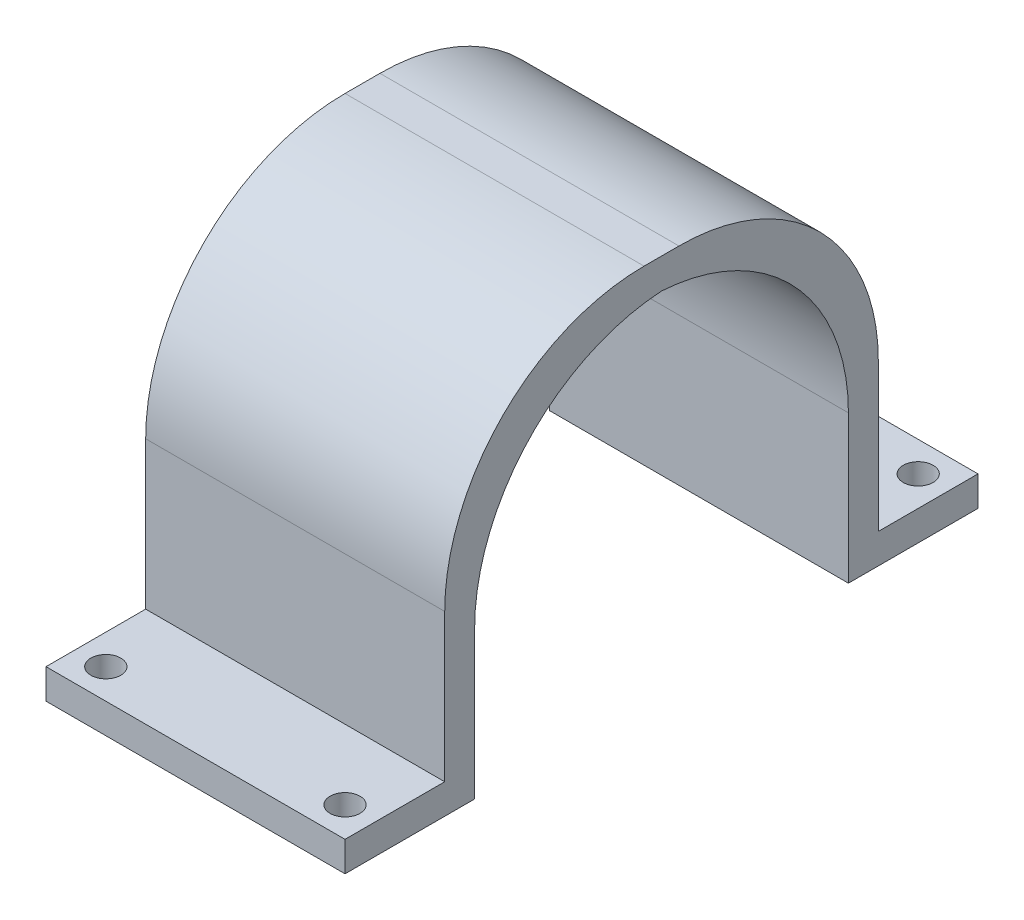
ISO-10303-21;
HEADER;
FILE_DESCRIPTION(('STEP AP214'),'2;1');
FILE_NAME('part.step','',(''),(''),'','','');
FILE_SCHEMA(('AUTOMOTIVE_DESIGN { 1 0 10303 214 1 1 1 1 }'));
ENDSEC;
DATA;
#1=APPLICATION_CONTEXT('core data for automotive mechanical design processes');
#2=APPLICATION_PROTOCOL_DEFINITION('international standard','automotive_design',2000,#1);
#3=PRODUCT_CONTEXT('',#1,'mechanical');
#4=PRODUCT('Part','Part','',(#3));
#5=PRODUCT_RELATED_PRODUCT_CATEGORY('part','',(#4));
#6=PRODUCT_DEFINITION_FORMATION('','',#4);
#7=PRODUCT_DEFINITION_CONTEXT('part definition',#1,'design');
#8=PRODUCT_DEFINITION('design','',#6,#7);
#9=PRODUCT_DEFINITION_SHAPE('','',#8);
#10=(LENGTH_UNIT() NAMED_UNIT(*) SI_UNIT(.MILLI.,.METRE.));
#11=(NAMED_UNIT(*) PLANE_ANGLE_UNIT() SI_UNIT($,.RADIAN.));
#12=(NAMED_UNIT(*) SI_UNIT($,.STERADIAN.) SOLID_ANGLE_UNIT());
#13=UNCERTAINTY_MEASURE_WITH_UNIT(LENGTH_MEASURE(1.E-05),#10,'distance_accuracy_value','');
#14=(GEOMETRIC_REPRESENTATION_CONTEXT(3) GLOBAL_UNCERTAINTY_ASSIGNED_CONTEXT((#13)) GLOBAL_UNIT_ASSIGNED_CONTEXT((#10,
#11,#12)) REPRESENTATION_CONTEXT('',''));
#15=CARTESIAN_POINT('',(0.,0.,0.));
#16=DIRECTION('',(0.,0.,1.));
#17=DIRECTION('',(1.,0.,0.));
#18=AXIS2_PLACEMENT_3D('',#15,#16,#17);
#19=CARTESIAN_POINT('',(30.,-3.,0.));
#20=DIRECTION('',(0.,0.,-1.));
#21=DIRECTION('',(-1.,0.,0.));
#22=AXIS2_PLACEMENT_3D('',#19,#20,#21);
#23=PLANE('',#22);
#24=DIRECTION('',(0.,-1.,0.));
#25=VECTOR('',#24,1.);
#26=CARTESIAN_POINT('',(0.,-3.,0.));
#27=LINE('',#26,#25);
#28=CARTESIAN_POINT('',(0.,0.,0.));
#29=VERTEX_POINT('',#28);
#30=CARTESIAN_POINT('',(0.,-3.,0.));
#31=VERTEX_POINT('',#30);
#32=EDGE_CURVE('E177',#29,#31,#27,.T.);
#33=ORIENTED_EDGE('',*,*,#32,.T.);
#34=DIRECTION('',(-1.,0.,0.));
#35=VECTOR('',#34,1.);
#36=CARTESIAN_POINT('',(30.,-3.,0.));
#37=LINE('',#36,#35);
#38=CARTESIAN_POINT('',(30.,-3.,0.));
#39=VERTEX_POINT('',#38);
#40=EDGE_CURVE('E156',#39,#31,#37,.T.);
#41=ORIENTED_EDGE('',*,*,#40,.F.);
#42=DIRECTION('',(0.,-1.,0.));
#43=VECTOR('',#42,1.);
#44=CARTESIAN_POINT('',(30.,-3.,0.));
#45=LINE('',#44,#43);
#46=CARTESIAN_POINT('',(30.,0.,0.));
#47=VERTEX_POINT('',#46);
#48=EDGE_CURVE('E163',#47,#39,#45,.T.);
#49=ORIENTED_EDGE('',*,*,#48,.F.);
#50=DIRECTION('',(-1.,0.,0.));
#51=VECTOR('',#50,1.);
#52=CARTESIAN_POINT('',(30.,0.,0.));
#53=LINE('',#52,#51);
#54=EDGE_CURVE('E269',#47,#29,#53,.T.);
#55=ORIENTED_EDGE('',*,*,#54,.T.);
#56=EDGE_LOOP('',(#33,#41,#49,#55));
#57=FACE_BOUND('',#56,.T.);
#58=ADVANCED_FACE('F43',(#57),#23,.F.);
#59=CARTESIAN_POINT('',(30.,-3.,0.));
#60=DIRECTION('',(0.,1.,0.));
#61=DIRECTION('',(0.,0.,1.));
#62=AXIS2_PLACEMENT_3D('',#59,#60,#61);
#63=PLANE('',#62);
#64=CARTESIAN_POINT('',(27.,-3.,-3.));
#65=DIRECTION('',(0.,1.,0.));
#66=DIRECTION('',(0.,0.,1.));
#67=AXIS2_PLACEMENT_3D('',#64,#65,#66);
#68=CIRCLE('',#67,1.5);
#69=CARTESIAN_POINT('',(27.,-3.,-1.5));
#70=VERTEX_POINT('',#69);
#71=EDGE_CURVE('E342',#70,#70,#68,.T.);
#72=ORIENTED_EDGE('',*,*,#71,.T.);
#73=EDGE_LOOP('',(#72));
#74=FACE_BOUND('',#73,.T.);
#75=CARTESIAN_POINT('',(3.,-3.,-3.));
#76=DIRECTION('',(0.,1.,0.));
#77=DIRECTION('',(0.,0.,1.));
#78=AXIS2_PLACEMENT_3D('',#75,#76,#77);
#79=CIRCLE('',#78,1.5);
#80=CARTESIAN_POINT('',(3.,-3.,-1.5));
#81=VERTEX_POINT('',#80);
#82=EDGE_CURVE('E350',#81,#81,#79,.T.);
#83=ORIENTED_EDGE('',*,*,#82,.T.);
#84=EDGE_LOOP('',(#83));
#85=FACE_BOUND('',#84,.T.);
#86=DIRECTION('',(0.,0.,-1.));
#87=VECTOR('',#86,1.);
#88=CARTESIAN_POINT('',(0.,-3.,0.));
#89=LINE('',#88,#87);
#90=CARTESIAN_POINT('',(0.,-3.,-13.));
#91=VERTEX_POINT('',#90);
#92=EDGE_CURVE('E309',#31,#91,#89,.T.);
#93=ORIENTED_EDGE('',*,*,#92,.T.);
#94=DIRECTION('',(-1.,0.,0.));
#95=VECTOR('',#94,1.);
#96=CARTESIAN_POINT('',(30.,-3.,-13.));
#97=LINE('',#96,#95);
#98=CARTESIAN_POINT('',(30.,-3.,-13.));
#99=VERTEX_POINT('',#98);
#100=EDGE_CURVE('E159',#99,#91,#97,.T.);
#101=ORIENTED_EDGE('',*,*,#100,.F.);
#102=DIRECTION('',(0.,0.,-1.));
#103=VECTOR('',#102,1.);
#104=CARTESIAN_POINT('',(30.,-3.,0.));
#105=LINE('',#104,#103);
#106=EDGE_CURVE('E152',#39,#99,#105,.T.);
#107=ORIENTED_EDGE('',*,*,#106,.F.);
#108=ORIENTED_EDGE('',*,*,#40,.T.);
#109=EDGE_LOOP('',(#93,#101,#107,#108));
#110=FACE_BOUND('',#109,.T.);
#111=ADVANCED_FACE('F154',(#74,#85,#110),#63,.F.);
#112=CARTESIAN_POINT('',(30.,-3.,-13.));
#113=DIRECTION('',(0.,0.,1.));
#114=DIRECTION('',(1.,0.,0.));
#115=AXIS2_PLACEMENT_3D('',#112,#113,#114);
#116=PLANE('',#115);
#117=DIRECTION('',(0.,1.,0.));
#118=VECTOR('',#117,1.);
#119=CARTESIAN_POINT('',(0.,-3.,-13.));
#120=LINE('',#119,#118);
#121=CARTESIAN_POINT('',(0.,11.8,-13.));
#122=VERTEX_POINT('',#121);
#123=EDGE_CURVE('E303',#91,#122,#120,.T.);
#124=ORIENTED_EDGE('',*,*,#123,.T.);
#125=DIRECTION('',(-1.,0.,0.));
#126=VECTOR('',#125,1.);
#127=CARTESIAN_POINT('',(30.,11.8,-13.));
#128=LINE('',#127,#126);
#129=CARTESIAN_POINT('',(30.,11.8,-13.));
#130=VERTEX_POINT('',#129);
#131=EDGE_CURVE('E199',#122,#130,#128,.F.);
#132=ORIENTED_EDGE('',*,*,#131,.T.);
#133=DIRECTION('',(0.,1.,0.));
#134=VECTOR('',#133,1.);
#135=CARTESIAN_POINT('',(30.,-3.,-13.));
#136=LINE('',#135,#134);
#137=EDGE_CURVE('E162',#99,#130,#136,.T.);
#138=ORIENTED_EDGE('',*,*,#137,.F.);
#139=ORIENTED_EDGE('',*,*,#100,.T.);
#140=EDGE_LOOP('',(#124,#132,#138,#139));
#141=FACE_BOUND('',#140,.T.);
#142=ADVANCED_FACE('F390',(#141),#116,.F.);
#143=CARTESIAN_POINT('',(30.,31.8,-50.5));
#144=DIRECTION('',(0.,0.,-1.));
#145=DIRECTION('',(0.,1.,0.));
#146=AXIS2_PLACEMENT_3D('',#143,#144,#145);
#147=PLANE('',#146);
#148=DIRECTION('',(0.,-1.,0.));
#149=VECTOR('',#148,1.);
#150=CARTESIAN_POINT('',(30.,31.8,-50.5));
#151=LINE('',#150,#149);
#152=CARTESIAN_POINT('',(30.,11.8,-50.5));
#153=VERTEX_POINT('',#152);
#154=CARTESIAN_POINT('',(30.,-3.,-50.5));
#155=VERTEX_POINT('',#154);
#156=EDGE_CURVE('E328',#153,#155,#151,.T.);
#157=ORIENTED_EDGE('',*,*,#156,.F.);
#158=DIRECTION('',(-1.,0.,0.));
#159=VECTOR('',#158,1.);
#160=CARTESIAN_POINT('',(0.,11.8,-50.5));
#161=LINE('',#160,#159);
#162=CARTESIAN_POINT('',(0.,11.8,-50.5));
#163=VERTEX_POINT('',#162);
#164=EDGE_CURVE('E203',#153,#163,#161,.T.);
#165=ORIENTED_EDGE('',*,*,#164,.T.);
#166=DIRECTION('',(0.,-1.,0.));
#167=VECTOR('',#166,1.);
#168=CARTESIAN_POINT('',(0.,31.8,-50.5));
#169=LINE('',#168,#167);
#170=CARTESIAN_POINT('',(0.,-3.,-50.5));
#171=VERTEX_POINT('',#170);
#172=EDGE_CURVE('E298',#163,#171,#169,.T.);
#173=ORIENTED_EDGE('',*,*,#172,.T.);
#174=DIRECTION('',(-1.,0.,0.));
#175=VECTOR('',#174,1.);
#176=CARTESIAN_POINT('',(30.,-3.,-50.5));
#177=LINE('',#176,#175);
#178=EDGE_CURVE('E186',#155,#171,#177,.T.);
#179=ORIENTED_EDGE('',*,*,#178,.F.);
#180=EDGE_LOOP('',(#157,#165,#173,#179));
#181=FACE_BOUND('',#180,.T.);
#182=ADVANCED_FACE('F380',(#181),#147,.F.);
#183=CARTESIAN_POINT('',(30.,-3.,-50.5));
#184=DIRECTION('',(0.,1.,0.));
#185=DIRECTION('',(0.,0.,1.));
#186=AXIS2_PLACEMENT_3D('',#183,#184,#185);
#187=PLANE('',#186);
#188=CARTESIAN_POINT('',(3.,-3.,-60.5));
#189=DIRECTION('',(0.,1.,0.));
#190=DIRECTION('',(0.,0.,1.));
#191=AXIS2_PLACEMENT_3D('',#188,#189,#190);
#192=CIRCLE('',#191,1.5);
#193=CARTESIAN_POINT('',(3.,-3.,-59.));
#194=VERTEX_POINT('',#193);
#195=EDGE_CURVE('E358',#194,#194,#192,.T.);
#196=ORIENTED_EDGE('',*,*,#195,.T.);
#197=EDGE_LOOP('',(#196));
#198=FACE_BOUND('',#197,.T.);
#199=CARTESIAN_POINT('',(27.,-3.,-60.5));
#200=DIRECTION('',(0.,1.,0.));
#201=DIRECTION('',(0.,0.,1.));
#202=AXIS2_PLACEMENT_3D('',#199,#200,#201);
#203=CIRCLE('',#202,1.5);
#204=CARTESIAN_POINT('',(27.,-3.,-59.));
#205=VERTEX_POINT('',#204);
#206=EDGE_CURVE('E337',#205,#205,#203,.T.);
#207=ORIENTED_EDGE('',*,*,#206,.T.);
#208=EDGE_LOOP('',(#207));
#209=FACE_BOUND('',#208,.T.);
#210=DIRECTION('',(0.,0.,-1.));
#211=VECTOR('',#210,1.);
#212=CARTESIAN_POINT('',(0.,-3.,-50.5));
#213=LINE('',#212,#211);
#214=CARTESIAN_POINT('',(0.,-3.,-63.5));
#215=VERTEX_POINT('',#214);
#216=EDGE_CURVE('E293',#171,#215,#213,.T.);
#217=ORIENTED_EDGE('',*,*,#216,.T.);
#218=DIRECTION('',(-1.,0.,0.));
#219=VECTOR('',#218,1.);
#220=CARTESIAN_POINT('',(30.,-3.,-63.5));
#221=LINE('',#220,#219);
#222=CARTESIAN_POINT('',(30.,-3.,-63.5));
#223=VERTEX_POINT('',#222);
#224=EDGE_CURVE('E282',#223,#215,#221,.T.);
#225=ORIENTED_EDGE('',*,*,#224,.F.);
#226=DIRECTION('',(0.,0.,-1.));
#227=VECTOR('',#226,1.);
#228=CARTESIAN_POINT('',(30.,-3.,-50.5));
#229=LINE('',#228,#227);
#230=EDGE_CURVE('E294',#155,#223,#229,.T.);
#231=ORIENTED_EDGE('',*,*,#230,.F.);
#232=ORIENTED_EDGE('',*,*,#178,.T.);
#233=EDGE_LOOP('',(#217,#225,#231,#232));
#234=FACE_BOUND('',#233,.T.);
#235=ADVANCED_FACE('F291',(#198,#209,#234),#187,.F.);
#236=CARTESIAN_POINT('',(30.,-3.,-63.5));
#237=DIRECTION('',(0.,0.,1.));
#238=DIRECTION('',(1.,0.,0.));
#239=AXIS2_PLACEMENT_3D('',#236,#237,#238);
#240=PLANE('',#239);
#241=DIRECTION('',(0.,1.,0.));
#242=VECTOR('',#241,1.);
#243=CARTESIAN_POINT('',(0.,-3.,-63.5));
#244=LINE('',#243,#242);
#245=CARTESIAN_POINT('',(0.,0.,-63.5));
#246=VERTEX_POINT('',#245);
#247=EDGE_CURVE('E261',#215,#246,#244,.T.);
#248=ORIENTED_EDGE('',*,*,#247,.T.);
#249=DIRECTION('',(-1.,0.,0.));
#250=VECTOR('',#249,1.);
#251=CARTESIAN_POINT('',(30.,0.,-63.5));
#252=LINE('',#251,#250);
#253=CARTESIAN_POINT('',(30.,0.,-63.5));
#254=VERTEX_POINT('',#253);
#255=EDGE_CURVE('E278',#254,#246,#252,.T.);
#256=ORIENTED_EDGE('',*,*,#255,.F.);
#257=DIRECTION('',(0.,1.,0.));
#258=VECTOR('',#257,1.);
#259=CARTESIAN_POINT('',(30.,-3.,-63.5));
#260=LINE('',#259,#258);
#261=EDGE_CURVE('E323',#223,#254,#260,.T.);
#262=ORIENTED_EDGE('',*,*,#261,.F.);
#263=ORIENTED_EDGE('',*,*,#224,.T.);
#264=EDGE_LOOP('',(#248,#256,#262,#263));
#265=FACE_BOUND('',#264,.T.);
#266=ADVANCED_FACE('F371',(#265),#240,.F.);
#267=CARTESIAN_POINT('',(30.,0.,-53.5));
#268=DIRECTION('',(0.,-1.,0.));
#269=DIRECTION('',(0.,0.,-1.));
#270=AXIS2_PLACEMENT_3D('',#267,#268,#269);
#271=PLANE('',#270);
#272=CARTESIAN_POINT('',(3.,0.,-60.5));
#273=DIRECTION('',(0.,1.,0.));
#274=DIRECTION('',(0.,0.,1.));
#275=AXIS2_PLACEMENT_3D('',#272,#273,#274);
#276=CIRCLE('',#275,1.5);
#277=CARTESIAN_POINT('',(3.,0.,-59.));
#278=VERTEX_POINT('',#277);
#279=EDGE_CURVE('E338',#278,#278,#276,.T.);
#280=ORIENTED_EDGE('',*,*,#279,.F.);
#281=EDGE_LOOP('',(#280));
#282=FACE_BOUND('',#281,.T.);
#283=CARTESIAN_POINT('',(27.,0.,-60.5));
#284=DIRECTION('',(0.,1.,0.));
#285=DIRECTION('',(0.,0.,1.));
#286=AXIS2_PLACEMENT_3D('',#283,#284,#285);
#287=CIRCLE('',#286,1.5);
#288=CARTESIAN_POINT('',(27.,0.,-59.));
#289=VERTEX_POINT('',#288);
#290=EDGE_CURVE('E333',#289,#289,#287,.T.);
#291=ORIENTED_EDGE('',*,*,#290,.F.);
#292=EDGE_LOOP('',(#291));
#293=FACE_BOUND('',#292,.T.);
#294=DIRECTION('',(0.,0.,1.));
#295=VECTOR('',#294,1.);
#296=CARTESIAN_POINT('',(0.,0.,-53.5));
#297=LINE('',#296,#295);
#298=CARTESIAN_POINT('',(0.,0.,-53.5));
#299=VERTEX_POINT('',#298);
#300=EDGE_CURVE('E255',#246,#299,#297,.T.);
#301=ORIENTED_EDGE('',*,*,#300,.T.);
#302=DIRECTION('',(-1.,0.,0.));
#303=VECTOR('',#302,1.);
#304=CARTESIAN_POINT('',(30.,0.,-53.5));
#305=LINE('',#304,#303);
#306=CARTESIAN_POINT('',(30.,0.,-53.5));
#307=VERTEX_POINT('',#306);
#308=EDGE_CURVE('E253',#307,#299,#305,.T.);
#309=ORIENTED_EDGE('',*,*,#308,.F.);
#310=DIRECTION('',(0.,0.,1.));
#311=VECTOR('',#310,1.);
#312=CARTESIAN_POINT('',(30.,0.,-53.5));
#313=LINE('',#312,#311);
#314=EDGE_CURVE('E320',#254,#307,#313,.T.);
#315=ORIENTED_EDGE('',*,*,#314,.F.);
#316=ORIENTED_EDGE('',*,*,#255,.T.);
#317=EDGE_LOOP('',(#301,#309,#315,#316));
#318=FACE_BOUND('',#317,.T.);
#319=ADVANCED_FACE('F368',(#282,#293,#318),#271,.F.);
#320=CARTESIAN_POINT('',(30.,34.8,-53.5));
#321=DIRECTION('',(0.,0.,1.));
#322=DIRECTION('',(0.,-1.,0.));
#323=AXIS2_PLACEMENT_3D('',#320,#321,#322);
#324=PLANE('',#323);
#325=DIRECTION('',(0.,1.,0.));
#326=VECTOR('',#325,1.);
#327=CARTESIAN_POINT('',(0.,34.8,-53.5));
#328=LINE('',#327,#326);
#329=CARTESIAN_POINT('',(0.,14.8,-53.5));
#330=VERTEX_POINT('',#329);
#331=EDGE_CURVE('E247',#299,#330,#328,.T.);
#332=ORIENTED_EDGE('',*,*,#331,.T.);
#333=DIRECTION('',(-1.,0.,0.));
#334=VECTOR('',#333,1.);
#335=CARTESIAN_POINT('',(30.,14.8,-53.5));
#336=LINE('',#335,#334);
#337=CARTESIAN_POINT('',(30.,14.8,-53.5));
#338=VERTEX_POINT('',#337);
#339=EDGE_CURVE('E196',#330,#338,#336,.F.);
#340=ORIENTED_EDGE('',*,*,#339,.T.);
#341=DIRECTION('',(0.,1.,0.));
#342=VECTOR('',#341,1.);
#343=CARTESIAN_POINT('',(30.,34.8,-53.5));
#344=LINE('',#343,#342);
#345=EDGE_CURVE('E229',#307,#338,#344,.T.);
#346=ORIENTED_EDGE('',*,*,#345,.F.);
#347=ORIENTED_EDGE('',*,*,#308,.T.);
#348=EDGE_LOOP('',(#332,#340,#346,#347));
#349=FACE_BOUND('',#348,.T.);
#350=ADVANCED_FACE('F251',(#349),#324,.F.);
#351=CARTESIAN_POINT('',(30.,34.8,-10.));
#352=DIRECTION('',(0.,-1.,0.));
#353=DIRECTION('',(0.,0.,-1.));
#354=AXIS2_PLACEMENT_3D('',#351,#352,#353);
#355=PLANE('',#354);
#356=DIRECTION('',(0.,0.,1.));
#357=VECTOR('',#356,1.);
#358=CARTESIAN_POINT('',(0.,34.8,-10.));
#359=LINE('',#358,#357);
#360=CARTESIAN_POINT('',(0.,34.8,-33.5));
#361=VERTEX_POINT('',#360);
#362=CARTESIAN_POINT('',(0.,34.8,-30.));
#363=VERTEX_POINT('',#362);
#364=EDGE_CURVE('E248',#361,#363,#359,.T.);
#365=ORIENTED_EDGE('',*,*,#364,.T.);
#366=DIRECTION('',(-1.,0.,0.));
#367=VECTOR('',#366,1.);
#368=CARTESIAN_POINT('',(30.,34.8,-30.));
#369=LINE('',#368,#367);
#370=CARTESIAN_POINT('',(30.,34.8,-30.));
#371=VERTEX_POINT('',#370);
#372=EDGE_CURVE('E193',#363,#371,#369,.F.);
#373=ORIENTED_EDGE('',*,*,#372,.T.);
#374=DIRECTION('',(0.,0.,1.));
#375=VECTOR('',#374,1.);
#376=CARTESIAN_POINT('',(30.,34.8,-10.));
#377=LINE('',#376,#375);
#378=CARTESIAN_POINT('',(30.,34.8,-33.5));
#379=VERTEX_POINT('',#378);
#380=EDGE_CURVE('E226',#379,#371,#377,.T.);
#381=ORIENTED_EDGE('',*,*,#380,.F.);
#382=DIRECTION('',(-1.,0.,0.));
#383=VECTOR('',#382,1.);
#384=CARTESIAN_POINT('',(30.,34.8,-33.5));
#385=LINE('',#384,#383);
#386=EDGE_CURVE('E184',#379,#361,#385,.T.);
#387=ORIENTED_EDGE('',*,*,#386,.T.);
#388=EDGE_LOOP('',(#365,#373,#381,#387));
#389=FACE_BOUND('',#388,.T.);
#390=ADVANCED_FACE('F235',(#389),#355,.F.);
#391=CARTESIAN_POINT('',(30.,0.,-10.));
#392=DIRECTION('',(0.,0.,-1.));
#393=DIRECTION('',(-1.,0.,0.));
#394=AXIS2_PLACEMENT_3D('',#391,#392,#393);
#395=PLANE('',#394);
#396=DIRECTION('',(0.,-1.,0.));
#397=VECTOR('',#396,1.);
#398=CARTESIAN_POINT('',(30.,0.,-10.));
#399=LINE('',#398,#397);
#400=CARTESIAN_POINT('',(30.,14.8,-10.));
#401=VERTEX_POINT('',#400);
#402=CARTESIAN_POINT('',(30.,0.,-10.));
#403=VERTEX_POINT('',#402);
#404=EDGE_CURVE('E239',#401,#403,#399,.T.);
#405=ORIENTED_EDGE('',*,*,#404,.F.);
#406=DIRECTION('',(-1.,0.,0.));
#407=VECTOR('',#406,1.);
#408=CARTESIAN_POINT('',(30.,14.8,-10.));
#409=LINE('',#408,#407);
#410=CARTESIAN_POINT('',(0.,14.8,-10.));
#411=VERTEX_POINT('',#410);
#412=EDGE_CURVE('E179',#401,#411,#409,.T.);
#413=ORIENTED_EDGE('',*,*,#412,.T.);
#414=DIRECTION('',(0.,-1.,0.));
#415=VECTOR('',#414,1.);
#416=CARTESIAN_POINT('',(0.,0.,-10.));
#417=LINE('',#416,#415);
#418=CARTESIAN_POINT('',(0.,0.,-10.));
#419=VERTEX_POINT('',#418);
#420=EDGE_CURVE('E259',#411,#419,#417,.T.);
#421=ORIENTED_EDGE('',*,*,#420,.T.);
#422=DIRECTION('',(-1.,0.,0.));
#423=VECTOR('',#422,1.);
#424=CARTESIAN_POINT('',(30.,0.,-10.));
#425=LINE('',#424,#423);
#426=EDGE_CURVE('E272',#403,#419,#425,.T.);
#427=ORIENTED_EDGE('',*,*,#426,.F.);
#428=EDGE_LOOP('',(#405,#413,#421,#427));
#429=FACE_BOUND('',#428,.T.);
#430=ADVANCED_FACE('F449',(#429),#395,.F.);
#431=CARTESIAN_POINT('',(30.,0.,0.));
#432=DIRECTION('',(0.,-1.,0.));
#433=DIRECTION('',(0.,0.,-1.));
#434=AXIS2_PLACEMENT_3D('',#431,#432,#433);
#435=PLANE('',#434);
#436=CARTESIAN_POINT('',(27.,0.,-3.));
#437=DIRECTION('',(0.,1.,0.));
#438=DIRECTION('',(0.,0.,1.));
#439=AXIS2_PLACEMENT_3D('',#436,#437,#438);
#440=CIRCLE('',#439,1.5);
#441=CARTESIAN_POINT('',(27.,0.,-1.5));
#442=VERTEX_POINT('',#441);
#443=EDGE_CURVE('E346',#442,#442,#440,.T.);
#444=ORIENTED_EDGE('',*,*,#443,.F.);
#445=EDGE_LOOP('',(#444));
#446=FACE_BOUND('',#445,.T.);
#447=CARTESIAN_POINT('',(3.,0.,-3.));
#448=DIRECTION('',(0.,1.,0.));
#449=DIRECTION('',(0.,0.,1.));
#450=AXIS2_PLACEMENT_3D('',#447,#448,#449);
#451=CIRCLE('',#450,1.5);
#452=CARTESIAN_POINT('',(3.,0.,-1.5));
#453=VERTEX_POINT('',#452);
#454=EDGE_CURVE('E354',#453,#453,#451,.T.);
#455=ORIENTED_EDGE('',*,*,#454,.F.);
#456=EDGE_LOOP('',(#455));
#457=FACE_BOUND('',#456,.T.);
#458=DIRECTION('',(0.,0.,1.));
#459=VECTOR('',#458,1.);
#460=CARTESIAN_POINT('',(0.,0.,0.));
#461=LINE('',#460,#459);
#462=EDGE_CURVE('E174',#419,#29,#461,.T.);
#463=ORIENTED_EDGE('',*,*,#462,.T.);
#464=ORIENTED_EDGE('',*,*,#54,.F.);
#465=DIRECTION('',(0.,0.,1.));
#466=VECTOR('',#465,1.);
#467=CARTESIAN_POINT('',(30.,0.,0.));
#468=LINE('',#467,#466);
#469=EDGE_CURVE('E169',#403,#47,#468,.T.);
#470=ORIENTED_EDGE('',*,*,#469,.F.);
#471=ORIENTED_EDGE('',*,*,#426,.T.);
#472=EDGE_LOOP('',(#463,#464,#470,#471));
#473=FACE_BOUND('',#472,.T.);
#474=ADVANCED_FACE('F441',(#446,#457,#473),#435,.F.);
#475=CARTESIAN_POINT('',(30.,0.,0.));
#476=DIRECTION('',(-1.,0.,0.));
#477=DIRECTION('',(0.,0.,1.));
#478=AXIS2_PLACEMENT_3D('',#475,#476,#477);
#479=PLANE('',#478);
#480=ORIENTED_EDGE('',*,*,#380,.T.);
#481=CARTESIAN_POINT('',(30.,14.8,-30.));
#482=DIRECTION('',(-1.,0.,0.));
#483=DIRECTION('',(0.,0.,1.));
#484=AXIS2_PLACEMENT_3D('',#481,#482,#483);
#485=CIRCLE('',#484,20.);
#486=EDGE_CURVE('E11',#371,#401,#485,.F.);
#487=ORIENTED_EDGE('',*,*,#486,.T.);
#488=ORIENTED_EDGE('',*,*,#404,.T.);
#489=ORIENTED_EDGE('',*,*,#469,.T.);
#490=ORIENTED_EDGE('',*,*,#48,.T.);
#491=ORIENTED_EDGE('',*,*,#106,.T.);
#492=ORIENTED_EDGE('',*,*,#137,.T.);
#493=CARTESIAN_POINT('',(30.,11.8,-33.));
#494=DIRECTION('',(-1.,0.,0.));
#495=DIRECTION('',(0.,0.,1.));
#496=AXIS2_PLACEMENT_3D('',#493,#494,#495);
#497=CIRCLE('',#496,20.);
#498=CARTESIAN_POINT('',(30.,31.7608992783391,-31.75));
#499=VERTEX_POINT('',#498);
#500=EDGE_CURVE('E60',#130,#499,#497,.T.);
#501=ORIENTED_EDGE('',*,*,#500,.T.);
#502=CARTESIAN_POINT('',(30.,11.8,-30.5));
#503=DIRECTION('',(-1.,0.,0.));
#504=DIRECTION('',(0.,0.,1.));
#505=AXIS2_PLACEMENT_3D('',#502,#503,#504);
#506=CIRCLE('',#505,20.);
#507=EDGE_CURVE('E213',#499,#153,#506,.T.);
#508=ORIENTED_EDGE('',*,*,#507,.T.);
#509=ORIENTED_EDGE('',*,*,#156,.T.);
#510=ORIENTED_EDGE('',*,*,#230,.T.);
#511=ORIENTED_EDGE('',*,*,#261,.T.);
#512=ORIENTED_EDGE('',*,*,#314,.T.);
#513=ORIENTED_EDGE('',*,*,#345,.T.);
#514=CARTESIAN_POINT('',(30.,14.8,-33.5));
#515=DIRECTION('',(-1.,0.,0.));
#516=DIRECTION('',(0.,0.,1.));
#517=AXIS2_PLACEMENT_3D('',#514,#515,#516);
#518=CIRCLE('',#517,20.);
#519=EDGE_CURVE('E53',#338,#379,#518,.F.);
#520=ORIENTED_EDGE('',*,*,#519,.T.);
#521=EDGE_LOOP('',(#480,#487,#488,#489,#490,#491,#492,#501,#508,#509,#510,#511,#512,#513,#520));
#522=FACE_BOUND('',#521,.T.);
#523=ADVANCED_FACE('F167',(#522),#479,.F.);
#524=CARTESIAN_POINT('',(0.,0.,0.));
#525=DIRECTION('',(-1.,0.,0.));
#526=DIRECTION('',(0.,0.,1.));
#527=AXIS2_PLACEMENT_3D('',#524,#525,#526);
#528=PLANE('',#527);
#529=ORIENTED_EDGE('',*,*,#420,.F.);
#530=CARTESIAN_POINT('',(0.,14.8,-30.));
#531=DIRECTION('',(-1.,0.,0.));
#532=DIRECTION('',(0.,0.,1.));
#533=AXIS2_PLACEMENT_3D('',#530,#531,#532);
#534=CIRCLE('',#533,20.);
#535=EDGE_CURVE('E219',#411,#363,#534,.T.);
#536=ORIENTED_EDGE('',*,*,#535,.T.);
#537=ORIENTED_EDGE('',*,*,#364,.F.);
#538=CARTESIAN_POINT('',(0.,14.8,-33.5));
#539=DIRECTION('',(-1.,0.,0.));
#540=DIRECTION('',(0.,0.,1.));
#541=AXIS2_PLACEMENT_3D('',#538,#539,#540);
#542=CIRCLE('',#541,20.);
#543=EDGE_CURVE('E216',#361,#330,#542,.T.);
#544=ORIENTED_EDGE('',*,*,#543,.T.);
#545=ORIENTED_EDGE('',*,*,#331,.F.);
#546=ORIENTED_EDGE('',*,*,#300,.F.);
#547=ORIENTED_EDGE('',*,*,#247,.F.);
#548=ORIENTED_EDGE('',*,*,#216,.F.);
#549=ORIENTED_EDGE('',*,*,#172,.F.);
#550=CARTESIAN_POINT('',(0.,11.8,-30.5));
#551=DIRECTION('',(-1.,0.,0.));
#552=DIRECTION('',(0.,0.,1.));
#553=AXIS2_PLACEMENT_3D('',#550,#551,#552);
#554=CIRCLE('',#553,20.);
#555=CARTESIAN_POINT('',(0.,31.7608992783391,-31.75));
#556=VERTEX_POINT('',#555);
#557=EDGE_CURVE('E68',#163,#556,#554,.F.);
#558=ORIENTED_EDGE('',*,*,#557,.T.);
#559=CARTESIAN_POINT('',(0.,11.8,-33.));
#560=DIRECTION('',(-1.,0.,0.));
#561=DIRECTION('',(0.,0.,1.));
#562=AXIS2_PLACEMENT_3D('',#559,#560,#561);
#563=CIRCLE('',#562,20.);
#564=EDGE_CURVE('E206',#556,#122,#563,.F.);
#565=ORIENTED_EDGE('',*,*,#564,.T.);
#566=ORIENTED_EDGE('',*,*,#123,.F.);
#567=ORIENTED_EDGE('',*,*,#92,.F.);
#568=ORIENTED_EDGE('',*,*,#32,.F.);
#569=ORIENTED_EDGE('',*,*,#462,.F.);
#570=EDGE_LOOP('',(#529,#536,#537,#544,#545,#546,#547,#548,#549,#558,#565,#566,#567,#568,#569));
#571=FACE_BOUND('',#570,.T.);
#572=ADVANCED_FACE('F245',(#571),#528,.T.);
#573=CARTESIAN_POINT('',(30.,14.8,-30.));
#574=DIRECTION('',(-1.,0.,0.));
#575=DIRECTION('',(0.,0.,1.));
#576=AXIS2_PLACEMENT_3D('',#573,#574,#575);
#577=CYLINDRICAL_SURFACE('',#576,20.);
#578=ORIENTED_EDGE('',*,*,#486,.F.);
#579=ORIENTED_EDGE('',*,*,#372,.F.);
#580=ORIENTED_EDGE('',*,*,#535,.F.);
#581=ORIENTED_EDGE('',*,*,#412,.F.);
#582=EDGE_LOOP('',(#578,#579,#580,#581));
#583=FACE_BOUND('',#582,.T.);
#584=ADVANCED_FACE('F405',(#583),#577,.T.);
#585=CARTESIAN_POINT('',(30.,14.8,-33.5));
#586=DIRECTION('',(-1.,0.,0.));
#587=DIRECTION('',(0.,0.,1.));
#588=AXIS2_PLACEMENT_3D('',#585,#586,#587);
#589=CYLINDRICAL_SURFACE('',#588,20.);
#590=ORIENTED_EDGE('',*,*,#519,.F.);
#591=ORIENTED_EDGE('',*,*,#339,.F.);
#592=ORIENTED_EDGE('',*,*,#543,.F.);
#593=ORIENTED_EDGE('',*,*,#386,.F.);
#594=EDGE_LOOP('',(#590,#591,#592,#593));
#595=FACE_BOUND('',#594,.T.);
#596=ADVANCED_FACE('F241',(#595),#589,.T.);
#597=CARTESIAN_POINT('',(30.,11.8,-30.5));
#598=DIRECTION('',(1.,0.,0.));
#599=DIRECTION('',(0.,0.,-1.));
#600=AXIS2_PLACEMENT_3D('',#597,#598,#599);
#601=CYLINDRICAL_SURFACE('',#600,20.);
#602=ORIENTED_EDGE('',*,*,#164,.F.);
#603=ORIENTED_EDGE('',*,*,#507,.F.);
#604=DIRECTION('',(1.,0.,0.));
#605=VECTOR('',#604,1.);
#606=CARTESIAN_POINT('',(15.,31.7608992783391,-31.75));
#607=LINE('',#606,#605);
#608=EDGE_CURVE('E47',#556,#499,#607,.T.);
#609=ORIENTED_EDGE('',*,*,#608,.F.);
#610=ORIENTED_EDGE('',*,*,#557,.F.);
#611=EDGE_LOOP('',(#602,#603,#609,#610));
#612=FACE_BOUND('',#611,.T.);
#613=ADVANCED_FACE('F45',(#612),#601,.F.);
#614=CARTESIAN_POINT('',(30.,11.8,-33.));
#615=DIRECTION('',(1.,0.,0.));
#616=DIRECTION('',(0.,0.,-1.));
#617=AXIS2_PLACEMENT_3D('',#614,#615,#616);
#618=CYLINDRICAL_SURFACE('',#617,20.);
#619=ORIENTED_EDGE('',*,*,#500,.F.);
#620=ORIENTED_EDGE('',*,*,#131,.F.);
#621=ORIENTED_EDGE('',*,*,#564,.F.);
#622=ORIENTED_EDGE('',*,*,#608,.T.);
#623=EDGE_LOOP('',(#619,#620,#621,#622));
#624=FACE_BOUND('',#623,.T.);
#625=ADVANCED_FACE('F387',(#624),#618,.F.);
#626=CARTESIAN_POINT('',(3.,-3.,-3.));
#627=DIRECTION('',(0.,1.,0.));
#628=DIRECTION('',(0.,0.,1.));
#629=AXIS2_PLACEMENT_3D('',#626,#627,#628);
#630=CYLINDRICAL_SURFACE('',#629,1.5);
#631=ORIENTED_EDGE('',*,*,#82,.F.);
#632=EDGE_LOOP('',(#631));
#633=FACE_BOUND('',#632,.T.);
#634=ORIENTED_EDGE('',*,*,#454,.T.);
#635=EDGE_LOOP('',(#634));
#636=FACE_BOUND('',#635,.T.);
#637=ADVANCED_FACE('F411',(#633,#636),#630,.F.);
#638=CARTESIAN_POINT('',(27.,-3.,-3.));
#639=DIRECTION('',(0.,1.,0.));
#640=DIRECTION('',(0.,0.,1.));
#641=AXIS2_PLACEMENT_3D('',#638,#639,#640);
#642=CYLINDRICAL_SURFACE('',#641,1.5);
#643=ORIENTED_EDGE('',*,*,#71,.F.);
#644=EDGE_LOOP('',(#643));
#645=FACE_BOUND('',#644,.T.);
#646=ORIENTED_EDGE('',*,*,#443,.T.);
#647=EDGE_LOOP('',(#646));
#648=FACE_BOUND('',#647,.T.);
#649=ADVANCED_FACE('F416',(#645,#648),#642,.F.);
#650=CARTESIAN_POINT('',(27.,-3.,-60.5));
#651=DIRECTION('',(0.,1.,0.));
#652=DIRECTION('',(0.,0.,1.));
#653=AXIS2_PLACEMENT_3D('',#650,#651,#652);
#654=CYLINDRICAL_SURFACE('',#653,1.5);
#655=ORIENTED_EDGE('',*,*,#206,.F.);
#656=EDGE_LOOP('',(#655));
#657=FACE_BOUND('',#656,.T.);
#658=ORIENTED_EDGE('',*,*,#290,.T.);
#659=EDGE_LOOP('',(#658));
#660=FACE_BOUND('',#659,.T.);
#661=ADVANCED_FACE('F538',(#657,#660),#654,.F.);
#662=CARTESIAN_POINT('',(3.,-3.,-60.5));
#663=DIRECTION('',(0.,1.,0.));
#664=DIRECTION('',(0.,0.,1.));
#665=AXIS2_PLACEMENT_3D('',#662,#663,#664);
#666=CYLINDRICAL_SURFACE('',#665,1.5);
#667=ORIENTED_EDGE('',*,*,#195,.F.);
#668=EDGE_LOOP('',(#667));
#669=FACE_BOUND('',#668,.T.);
#670=ORIENTED_EDGE('',*,*,#279,.T.);
#671=EDGE_LOOP('',(#670));
#672=FACE_BOUND('',#671,.T.);
#673=ADVANCED_FACE('F366',(#669,#672),#666,.F.);
#674=CLOSED_SHELL('',(#58,#111,#142,#182,#235,#266,#319,#350,#390,#430,#474,#523,#572,#584,#596,
#613,#625,#637,#649,#661,#673));
#675=MANIFOLD_SOLID_BREP('B2',#674);
#676=ADVANCED_BREP_SHAPE_REPRESENTATION('',(#18,#675),#14);
#677=SHAPE_DEFINITION_REPRESENTATION(#9,#676);
ENDSEC;
END-ISO-10303-21;
